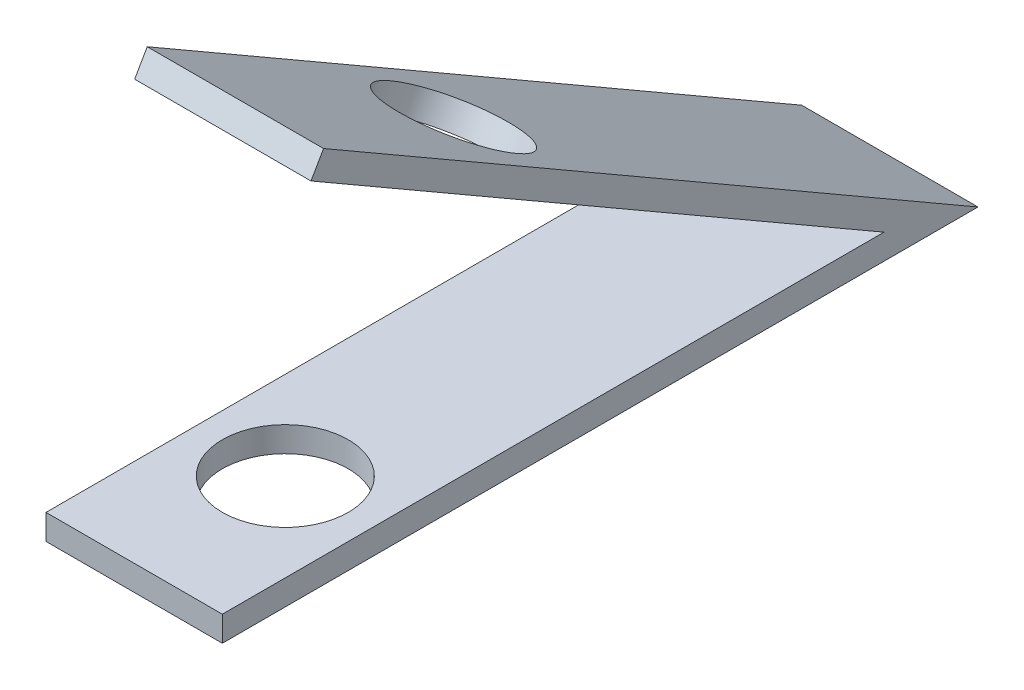
ISO-10303-21;
HEADER;
FILE_DESCRIPTION(('STEP AP214'),'2;1');
FILE_NAME('part.step','',(''),(''),'','','');
FILE_SCHEMA(('AUTOMOTIVE_DESIGN { 1 0 10303 214 1 1 1 1 }'));
ENDSEC;
DATA;
#1=APPLICATION_CONTEXT('core data for automotive mechanical design processes');
#2=APPLICATION_PROTOCOL_DEFINITION('international standard','automotive_design',2000,#1);
#3=PRODUCT_CONTEXT('',#1,'mechanical');
#4=PRODUCT('Part','Part','',(#3));
#5=PRODUCT_RELATED_PRODUCT_CATEGORY('part','',(#4));
#6=PRODUCT_DEFINITION_FORMATION('','',#4);
#7=PRODUCT_DEFINITION_CONTEXT('part definition',#1,'design');
#8=PRODUCT_DEFINITION('design','',#6,#7);
#9=PRODUCT_DEFINITION_SHAPE('','',#8);
#10=(LENGTH_UNIT() NAMED_UNIT(*) SI_UNIT(.MILLI.,.METRE.));
#11=(NAMED_UNIT(*) PLANE_ANGLE_UNIT() SI_UNIT($,.RADIAN.));
#12=(NAMED_UNIT(*) SI_UNIT($,.STERADIAN.) SOLID_ANGLE_UNIT());
#13=UNCERTAINTY_MEASURE_WITH_UNIT(LENGTH_MEASURE(1.E-05),#10,'distance_accuracy_value','');
#14=(GEOMETRIC_REPRESENTATION_CONTEXT(3) GLOBAL_UNCERTAINTY_ASSIGNED_CONTEXT((#13)) GLOBAL_UNIT_ASSIGNED_CONTEXT((#10,
#11,#12)) REPRESENTATION_CONTEXT('',''));
#15=CARTESIAN_POINT('',(0.,0.,0.));
#16=DIRECTION('',(0.,0.,1.));
#17=DIRECTION('',(1.,0.,0.));
#18=AXIS2_PLACEMENT_3D('',#15,#16,#17);
#19=CARTESIAN_POINT('',(70.,139.999999999998,222.487113059643));
#20=DIRECTION('',(0.,-0.499999999999994,-0.866025403784442));
#21=DIRECTION('',(0.,0.866025403784442,-0.499999999999994));
#22=AXIS2_PLACEMENT_3D('',#19,#20,#21);
#23=PLANE('',#22);
#24=DIRECTION('',(0.,-0.866025403784442,0.499999999999993));
#25=VECTOR('',#24,1.);
#26=CARTESIAN_POINT('',(0.,139.999999999998,222.487113059643));
#27=LINE('',#26,#25);
#28=CARTESIAN_POINT('',(0.,139.999999999998,222.487113059643));
#29=VERTEX_POINT('',#28);
#30=CARTESIAN_POINT('',(0.,131.339745962154,227.487113059643));
#31=VERTEX_POINT('',#30);
#32=EDGE_CURVE('E117',#29,#31,#27,.T.);
#33=ORIENTED_EDGE('',*,*,#32,.T.);
#34=DIRECTION('',(-1.,0.,0.));
#35=VECTOR('',#34,1.);
#36=CARTESIAN_POINT('',(70.,131.339745962154,227.487113059643));
#37=LINE('',#36,#35);
#38=CARTESIAN_POINT('',(70.,131.339745962154,227.487113059643));
#39=VERTEX_POINT('',#38);
#40=EDGE_CURVE('E11',#39,#31,#37,.T.);
#41=ORIENTED_EDGE('',*,*,#40,.F.);
#42=DIRECTION('',(0.,-0.866025403784442,0.499999999999993));
#43=VECTOR('',#42,1.);
#44=CARTESIAN_POINT('',(70.,139.999999999998,222.487113059643));
#45=LINE('',#44,#43);
#46=CARTESIAN_POINT('',(70.,139.999999999998,222.487113059643));
#47=VERTEX_POINT('',#46);
#48=EDGE_CURVE('E128',#47,#39,#45,.T.);
#49=ORIENTED_EDGE('',*,*,#48,.F.);
#50=DIRECTION('',(-1.,0.,0.));
#51=VECTOR('',#50,1.);
#52=CARTESIAN_POINT('',(70.,139.999999999998,222.487113059643));
#53=LINE('',#52,#51);
#54=EDGE_CURVE('E113',#47,#29,#53,.T.);
#55=ORIENTED_EDGE('',*,*,#54,.T.);
#56=EDGE_LOOP('',(#33,#41,#49,#55));
#57=FACE_BOUND('',#56,.T.);
#58=ADVANCED_FACE('F32',(#57),#23,.F.);
#59=CARTESIAN_POINT('',(70.,131.339745962154,227.487113059643));
#60=DIRECTION('',(0.,0.866025403784442,-0.499999999999995));
#61=DIRECTION('',(0.,0.499999999999995,0.866025403784442));
#62=AXIS2_PLACEMENT_3D('',#59,#60,#61);
#63=PLANE('',#62);
#64=CARTESIAN_POINT('',(35.,81.3397459621545,140.884572681199));
#65=DIRECTION('',(0.,0.866025403784442,-0.499999999999994));
#66=DIRECTION('',(0.,0.499999999999995,0.866025403784442));
#67=AXIS2_PLACEMENT_3D('',#64,#65,#66);
#68=CIRCLE('',#67,25.);
#69=CARTESIAN_POINT('',(35.,93.8397459621543,162.53520777581));
#70=VERTEX_POINT('',#69);
#71=EDGE_CURVE('E121',#70,#70,#68,.T.);
#72=ORIENTED_EDGE('',*,*,#71,.T.);
#73=EDGE_LOOP('',(#72));
#74=FACE_BOUND('',#73,.T.);
#75=DIRECTION('',(0.,-0.499999999999995,-0.866025403784442));
#76=VECTOR('',#75,1.);
#77=CARTESIAN_POINT('',(0.,131.339745962154,227.487113059643));
#78=LINE('',#77,#76);
#79=CARTESIAN_POINT('',(0.,0.,0.));
#80=VERTEX_POINT('',#79);
#81=EDGE_CURVE('E120',#31,#80,#78,.T.);
#82=ORIENTED_EDGE('',*,*,#81,.T.);
#83=DIRECTION('',(-1.,0.,0.));
#84=VECTOR('',#83,1.);
#85=CARTESIAN_POINT('',(70.,0.,0.));
#86=LINE('',#85,#84);
#87=CARTESIAN_POINT('',(70.,0.,0.));
#88=VERTEX_POINT('',#87);
#89=EDGE_CURVE('E41',#88,#80,#86,.T.);
#90=ORIENTED_EDGE('',*,*,#89,.F.);
#91=DIRECTION('',(0.,-0.499999999999995,-0.866025403784442));
#92=VECTOR('',#91,1.);
#93=CARTESIAN_POINT('',(70.,131.339745962154,227.487113059643));
#94=LINE('',#93,#92);
#95=EDGE_CURVE('E86',#39,#88,#94,.T.);
#96=ORIENTED_EDGE('',*,*,#95,.F.);
#97=ORIENTED_EDGE('',*,*,#40,.T.);
#98=EDGE_LOOP('',(#82,#90,#96,#97));
#99=FACE_BOUND('',#98,.T.);
#100=ADVANCED_FACE('F156',(#74,#99),#63,.F.);
#101=CARTESIAN_POINT('',(70.,0.,0.));
#102=DIRECTION('',(0.,-1.,0.));
#103=DIRECTION('',(0.,0.,-1.));
#104=AXIS2_PLACEMENT_3D('',#101,#102,#103);
#105=PLANE('',#104);
#106=CARTESIAN_POINT('',(35.,0.,202.679491924311));
#107=DIRECTION('',(0.,1.,0.));
#108=DIRECTION('',(0.,0.,1.));
#109=AXIS2_PLACEMENT_3D('',#106,#107,#108);
#110=CIRCLE('',#109,25.);
#111=CARTESIAN_POINT('',(35.,0.,227.679491924311));
#112=VERTEX_POINT('',#111);
#113=EDGE_CURVE('E239',#112,#112,#110,.T.);
#114=ORIENTED_EDGE('',*,*,#113,.F.);
#115=EDGE_LOOP('',(#114));
#116=FACE_BOUND('',#115,.T.);
#117=DIRECTION('',(0.,0.,1.));
#118=VECTOR('',#117,1.);
#119=CARTESIAN_POINT('',(0.,0.,0.));
#120=LINE('',#119,#118);
#121=CARTESIAN_POINT('',(0.,0.,262.679491924311));
#122=VERTEX_POINT('',#121);
#123=EDGE_CURVE('E123',#80,#122,#120,.T.);
#124=ORIENTED_EDGE('',*,*,#123,.T.);
#125=DIRECTION('',(-1.,0.,0.));
#126=VECTOR('',#125,1.);
#127=CARTESIAN_POINT('',(70.,0.,262.679491924311));
#128=LINE('',#127,#126);
#129=CARTESIAN_POINT('',(70.,0.,262.679491924311));
#130=VERTEX_POINT('',#129);
#131=EDGE_CURVE('E108',#130,#122,#128,.T.);
#132=ORIENTED_EDGE('',*,*,#131,.F.);
#133=DIRECTION('',(0.,0.,1.));
#134=VECTOR('',#133,1.);
#135=CARTESIAN_POINT('',(70.,0.,0.));
#136=LINE('',#135,#134);
#137=EDGE_CURVE('E99',#88,#130,#136,.T.);
#138=ORIENTED_EDGE('',*,*,#137,.F.);
#139=ORIENTED_EDGE('',*,*,#89,.T.);
#140=EDGE_LOOP('',(#124,#132,#138,#139));
#141=FACE_BOUND('',#140,.T.);
#142=ADVANCED_FACE('F135',(#116,#141),#105,.F.);
#143=CARTESIAN_POINT('',(70.,0.,262.679491924311));
#144=DIRECTION('',(0.,0.,-1.));
#145=DIRECTION('',(-1.,0.,0.));
#146=AXIS2_PLACEMENT_3D('',#143,#144,#145);
#147=PLANE('',#146);
#148=DIRECTION('',(0.,-1.,0.));
#149=VECTOR('',#148,1.);
#150=CARTESIAN_POINT('',(0.,0.,262.679491924311));
#151=LINE('',#150,#149);
#152=CARTESIAN_POINT('',(0.,-10.,262.679491924311));
#153=VERTEX_POINT('',#152);
#154=EDGE_CURVE('E107',#122,#153,#151,.T.);
#155=ORIENTED_EDGE('',*,*,#154,.T.);
#156=DIRECTION('',(-1.,0.,0.));
#157=VECTOR('',#156,1.);
#158=CARTESIAN_POINT('',(70.,-10.,262.679491924311));
#159=LINE('',#158,#157);
#160=CARTESIAN_POINT('',(70.,-10.,262.679491924311));
#161=VERTEX_POINT('',#160);
#162=EDGE_CURVE('E104',#161,#153,#159,.T.);
#163=ORIENTED_EDGE('',*,*,#162,.F.);
#164=DIRECTION('',(0.,-1.,0.));
#165=VECTOR('',#164,1.);
#166=CARTESIAN_POINT('',(70.,0.,262.679491924311));
#167=LINE('',#166,#165);
#168=EDGE_CURVE('E93',#130,#161,#167,.T.);
#169=ORIENTED_EDGE('',*,*,#168,.F.);
#170=ORIENTED_EDGE('',*,*,#131,.T.);
#171=EDGE_LOOP('',(#155,#163,#169,#170));
#172=FACE_BOUND('',#171,.T.);
#173=ADVANCED_FACE('F105',(#172),#147,.F.);
#174=CARTESIAN_POINT('',(70.,-10.,262.679491924311));
#175=DIRECTION('',(0.,1.,0.));
#176=DIRECTION('',(0.,0.,1.));
#177=AXIS2_PLACEMENT_3D('',#174,#175,#176);
#178=PLANE('',#177);
#179=CARTESIAN_POINT('',(35.,-10.,202.679491924311));
#180=DIRECTION('',(0.,1.,0.));
#181=DIRECTION('',(0.,0.,1.));
#182=AXIS2_PLACEMENT_3D('',#179,#180,#181);
#183=CIRCLE('',#182,25.);
#184=CARTESIAN_POINT('',(35.,-10.,227.679491924311));
#185=VERTEX_POINT('',#184);
#186=EDGE_CURVE('E35',#185,#185,#183,.T.);
#187=ORIENTED_EDGE('',*,*,#186,.T.);
#188=EDGE_LOOP('',(#187));
#189=FACE_BOUND('',#188,.T.);
#190=DIRECTION('',(0.,0.,-1.));
#191=VECTOR('',#190,1.);
#192=CARTESIAN_POINT('',(0.,-10.,262.679491924311));
#193=LINE('',#192,#191);
#194=CARTESIAN_POINT('',(0.,-10.,-37.3205080756892));
#195=VERTEX_POINT('',#194);
#196=EDGE_CURVE('E72',#153,#195,#193,.T.);
#197=ORIENTED_EDGE('',*,*,#196,.T.);
#198=DIRECTION('',(-1.,0.,0.));
#199=VECTOR('',#198,1.);
#200=CARTESIAN_POINT('',(70.,-10.,-37.3205080756892));
#201=LINE('',#200,#199);
#202=CARTESIAN_POINT('',(70.,-10.,-37.3205080756892));
#203=VERTEX_POINT('',#202);
#204=EDGE_CURVE('E109',#203,#195,#201,.T.);
#205=ORIENTED_EDGE('',*,*,#204,.F.);
#206=DIRECTION('',(0.,0.,-1.));
#207=VECTOR('',#206,1.);
#208=CARTESIAN_POINT('',(70.,-10.,262.679491924311));
#209=LINE('',#208,#207);
#210=EDGE_CURVE('E97',#161,#203,#209,.T.);
#211=ORIENTED_EDGE('',*,*,#210,.F.);
#212=ORIENTED_EDGE('',*,*,#162,.T.);
#213=EDGE_LOOP('',(#197,#205,#211,#212));
#214=FACE_BOUND('',#213,.T.);
#215=ADVANCED_FACE('F111',(#189,#214),#178,.F.);
#216=CARTESIAN_POINT('',(70.,-10.,-37.3205080756892));
#217=DIRECTION('',(0.,-0.866025403784442,0.499999999999995));
#218=DIRECTION('',(0.,-0.499999999999995,-0.866025403784442));
#219=AXIS2_PLACEMENT_3D('',#216,#217,#218);
#220=PLANE('',#219);
#221=CARTESIAN_POINT('',(35.,89.9999999999989,135.884572681199));
#222=DIRECTION('',(0.,0.866025403784442,-0.499999999999994));
#223=DIRECTION('',(0.,0.499999999999995,0.866025403784442));
#224=AXIS2_PLACEMENT_3D('',#221,#222,#223);
#225=CIRCLE('',#224,25.);
#226=CARTESIAN_POINT('',(35.,102.499999999999,157.53520777581));
#227=VERTEX_POINT('',#226);
#228=EDGE_CURVE('E235',#227,#227,#225,.T.);
#229=ORIENTED_EDGE('',*,*,#228,.F.);
#230=EDGE_LOOP('',(#229));
#231=FACE_BOUND('',#230,.T.);
#232=DIRECTION('',(0.,0.499999999999995,0.866025403784442));
#233=VECTOR('',#232,1.);
#234=CARTESIAN_POINT('',(0.,-10.,-37.3205080756892));
#235=LINE('',#234,#233);
#236=EDGE_CURVE('E78',#195,#29,#235,.T.);
#237=ORIENTED_EDGE('',*,*,#236,.T.);
#238=ORIENTED_EDGE('',*,*,#54,.F.);
#239=DIRECTION('',(0.,0.499999999999995,0.866025403784442));
#240=VECTOR('',#239,1.);
#241=CARTESIAN_POINT('',(70.,-10.,-37.3205080756892));
#242=LINE('',#241,#240);
#243=EDGE_CURVE('E49',#203,#47,#242,.T.);
#244=ORIENTED_EDGE('',*,*,#243,.F.);
#245=ORIENTED_EDGE('',*,*,#204,.T.);
#246=EDGE_LOOP('',(#237,#238,#244,#245));
#247=FACE_BOUND('',#246,.T.);
#248=ADVANCED_FACE('F142',(#231,#247),#220,.F.);
#249=CARTESIAN_POINT('',(70.,0.,0.));
#250=DIRECTION('',(1.,0.,0.));
#251=DIRECTION('',(0.,0.,-1.));
#252=AXIS2_PLACEMENT_3D('',#249,#250,#251);
#253=PLANE('',#252);
#254=ORIENTED_EDGE('',*,*,#48,.T.);
#255=ORIENTED_EDGE('',*,*,#95,.T.);
#256=ORIENTED_EDGE('',*,*,#137,.T.);
#257=ORIENTED_EDGE('',*,*,#168,.T.);
#258=ORIENTED_EDGE('',*,*,#210,.T.);
#259=ORIENTED_EDGE('',*,*,#243,.T.);
#260=EDGE_LOOP('',(#254,#255,#256,#257,#258,#259));
#261=FACE_BOUND('',#260,.T.);
#262=ADVANCED_FACE('F95',(#261),#253,.T.);
#263=CARTESIAN_POINT('',(0.,0.,0.));
#264=DIRECTION('',(1.,0.,0.));
#265=DIRECTION('',(0.,0.,-1.));
#266=AXIS2_PLACEMENT_3D('',#263,#264,#265);
#267=PLANE('',#266);
#268=ORIENTED_EDGE('',*,*,#32,.F.);
#269=ORIENTED_EDGE('',*,*,#236,.F.);
#270=ORIENTED_EDGE('',*,*,#196,.F.);
#271=ORIENTED_EDGE('',*,*,#154,.F.);
#272=ORIENTED_EDGE('',*,*,#123,.F.);
#273=ORIENTED_EDGE('',*,*,#81,.F.);
#274=EDGE_LOOP('',(#268,#269,#270,#271,#272,#273));
#275=FACE_BOUND('',#274,.T.);
#276=ADVANCED_FACE('F138',(#275),#267,.F.);
#277=CARTESIAN_POINT('',(35.,81.3397459621545,140.884572681199));
#278=DIRECTION('',(0.,0.866025403784442,-0.499999999999995));
#279=DIRECTION('',(0.,0.499999999999995,0.866025403784442));
#280=AXIS2_PLACEMENT_3D('',#277,#278,#279);
#281=CYLINDRICAL_SURFACE('',#280,25.);
#282=ORIENTED_EDGE('',*,*,#71,.F.);
#283=EDGE_LOOP('',(#282));
#284=FACE_BOUND('',#283,.T.);
#285=ORIENTED_EDGE('',*,*,#228,.T.);
#286=EDGE_LOOP('',(#285));
#287=FACE_BOUND('',#286,.T.);
#288=ADVANCED_FACE('F191',(#284,#287),#281,.F.);
#289=CARTESIAN_POINT('',(35.,-300.,202.679491924311));
#290=DIRECTION('',(0.,1.,0.));
#291=DIRECTION('',(0.,0.,1.));
#292=AXIS2_PLACEMENT_3D('',#289,#290,#291);
#293=CYLINDRICAL_SURFACE('',#292,25.);
#294=ORIENTED_EDGE('',*,*,#113,.T.);
#295=EDGE_LOOP('',(#294));
#296=FACE_BOUND('',#295,.T.);
#297=ORIENTED_EDGE('',*,*,#186,.F.);
#298=EDGE_LOOP('',(#297));
#299=FACE_BOUND('',#298,.T.);
#300=ADVANCED_FACE('F187',(#296,#299),#293,.F.);
#301=CLOSED_SHELL('',(#58,#100,#142,#173,#215,#248,#262,#276,#288,#300));
#302=MANIFOLD_SOLID_BREP('B2',#301);
#303=ADVANCED_BREP_SHAPE_REPRESENTATION('',(#18,#302),#14);
#304=SHAPE_DEFINITION_REPRESENTATION(#9,#303);
ENDSEC;
END-ISO-10303-21;
